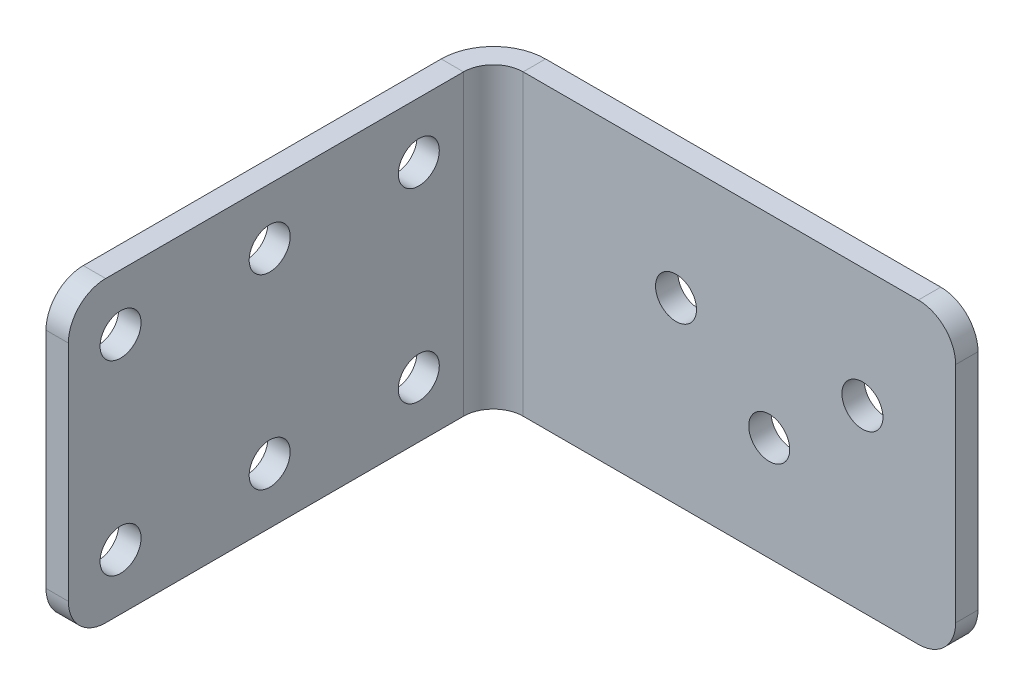
ISO-10303-21;
HEADER;
FILE_DESCRIPTION(('STEP AP214'),'2;1');
FILE_NAME('part.step','',(''),(''),'','','');
FILE_SCHEMA(('AUTOMOTIVE_DESIGN { 1 0 10303 214 1 1 1 1 }'));
ENDSEC;
DATA;
#1=APPLICATION_CONTEXT('core data for automotive mechanical design processes');
#2=APPLICATION_PROTOCOL_DEFINITION('international standard','automotive_design',2000,#1);
#3=PRODUCT_CONTEXT('',#1,'mechanical');
#4=PRODUCT('Part','Part','',(#3));
#5=PRODUCT_RELATED_PRODUCT_CATEGORY('part','',(#4));
#6=PRODUCT_DEFINITION_FORMATION('','',#4);
#7=PRODUCT_DEFINITION_CONTEXT('part definition',#1,'design');
#8=PRODUCT_DEFINITION('design','',#6,#7);
#9=PRODUCT_DEFINITION_SHAPE('','',#8);
#10=(LENGTH_UNIT() NAMED_UNIT(*) SI_UNIT(.MILLI.,.METRE.));
#11=(NAMED_UNIT(*) PLANE_ANGLE_UNIT() SI_UNIT($,.RADIAN.));
#12=(NAMED_UNIT(*) SI_UNIT($,.STERADIAN.) SOLID_ANGLE_UNIT());
#13=UNCERTAINTY_MEASURE_WITH_UNIT(LENGTH_MEASURE(1.E-05),#10,'distance_accuracy_value','');
#14=(GEOMETRIC_REPRESENTATION_CONTEXT(3) GLOBAL_UNCERTAINTY_ASSIGNED_CONTEXT((#13)) GLOBAL_UNIT_ASSIGNED_CONTEXT((#10,
#11,#12)) REPRESENTATION_CONTEXT('',''));
#15=CARTESIAN_POINT('',(0.,0.,0.));
#16=DIRECTION('',(0.,0.,1.));
#17=DIRECTION('',(1.,0.,0.));
#18=AXIS2_PLACEMENT_3D('',#15,#16,#17);
#19=CARTESIAN_POINT('',(7.,20.,0.));
#20=DIRECTION('',(0.,1.,0.));
#21=DIRECTION('',(0.,0.,1.));
#22=AXIS2_PLACEMENT_3D('',#19,#20,#21);
#23=PLANE('',#22);
#24=DIRECTION('',(0.,0.,1.));
#25=VECTOR('',#24,1.);
#26=CARTESIAN_POINT('',(7.,20.,0.));
#27=LINE('',#26,#25);
#28=CARTESIAN_POINT('',(7.,20.,0.));
#29=VERTEX_POINT('',#28);
#30=CARTESIAN_POINT('',(7.,20.,3.));
#31=VERTEX_POINT('',#30);
#32=EDGE_CURVE('E154',#29,#31,#27,.T.);
#33=ORIENTED_EDGE('',*,*,#32,.F.);
#34=CARTESIAN_POINT('',(7.,20.,7.));
#35=DIRECTION('',(0.,-1.,0.));
#36=DIRECTION('',(0.,0.,-1.));
#37=AXIS2_PLACEMENT_3D('',#34,#35,#36);
#38=CIRCLE('',#37,7.);
#39=CARTESIAN_POINT('',(0.,20.,7.));
#40=VERTEX_POINT('',#39);
#41=EDGE_CURVE('E150',#29,#40,#38,.F.);
#42=ORIENTED_EDGE('',*,*,#41,.T.);
#43=DIRECTION('',(-1.,0.,0.));
#44=VECTOR('',#43,1.);
#45=CARTESIAN_POINT('',(3.,20.,7.));
#46=LINE('',#45,#44);
#47=CARTESIAN_POINT('',(3.,20.,7.));
#48=VERTEX_POINT('',#47);
#49=EDGE_CURVE('E143',#48,#40,#46,.T.);
#50=ORIENTED_EDGE('',*,*,#49,.F.);
#51=CARTESIAN_POINT('',(7.,20.,7.));
#52=DIRECTION('',(0.,1.,0.));
#53=DIRECTION('',(1.,0.,0.));
#54=AXIS2_PLACEMENT_3D('',#51,#52,#53);
#55=CIRCLE('',#54,4.);
#56=EDGE_CURVE('E149',#31,#48,#55,.T.);
#57=ORIENTED_EDGE('',*,*,#56,.F.);
#58=EDGE_LOOP('',(#33,#42,#50,#57));
#59=FACE_BOUND('',#58,.T.);
#60=ADVANCED_FACE('F55',(#59),#23,.T.);
#61=CARTESIAN_POINT('',(3.,20.,7.));
#62=DIRECTION('',(0.,1.,0.));
#63=DIRECTION('',(0.,0.,1.));
#64=AXIS2_PLACEMENT_3D('',#61,#62,#63);
#65=PLANE('',#64);
#66=DIRECTION('',(1.,0.,0.));
#67=VECTOR('',#66,1.);
#68=CARTESIAN_POINT('',(0.,20.,3.));
#69=LINE('',#68,#67);
#70=CARTESIAN_POINT('',(60.,20.,3.));
#71=VERTEX_POINT('',#70);
#72=EDGE_CURVE('E174',#71,#31,#69,.F.);
#73=ORIENTED_EDGE('',*,*,#72,.F.);
#74=DIRECTION('',(0.,0.,1.));
#75=VECTOR('',#74,1.);
#76=CARTESIAN_POINT('',(60.,20.,7.));
#77=LINE('',#76,#75);
#78=CARTESIAN_POINT('',(60.,20.,0.));
#79=VERTEX_POINT('',#78);
#80=EDGE_CURVE('E233',#71,#79,#77,.F.);
#81=ORIENTED_EDGE('',*,*,#80,.T.);
#82=DIRECTION('',(-1.,0.,0.));
#83=VECTOR('',#82,1.);
#84=CARTESIAN_POINT('',(0.,20.,0.));
#85=LINE('',#84,#83);
#86=EDGE_CURVE('E180',#79,#29,#85,.T.);
#87=ORIENTED_EDGE('',*,*,#86,.T.);
#88=ORIENTED_EDGE('',*,*,#32,.T.);
#89=EDGE_LOOP('',(#73,#81,#87,#88));
#90=FACE_BOUND('',#89,.T.);
#91=ADVANCED_FACE('F351',(#90),#65,.T.);
#92=CARTESIAN_POINT('',(0.,-20.,7.));
#93=DIRECTION('',(0.,-1.,0.));
#94=DIRECTION('',(0.,0.,-1.));
#95=AXIS2_PLACEMENT_3D('',#92,#93,#94);
#96=PLANE('',#95);
#97=DIRECTION('',(1.,0.,0.));
#98=VECTOR('',#97,1.);
#99=CARTESIAN_POINT('',(0.,-20.,7.));
#100=LINE('',#99,#98);
#101=CARTESIAN_POINT('',(0.,-20.,7.));
#102=VERTEX_POINT('',#101);
#103=CARTESIAN_POINT('',(3.,-20.,7.));
#104=VERTEX_POINT('',#103);
#105=EDGE_CURVE('E151',#102,#104,#100,.T.);
#106=ORIENTED_EDGE('',*,*,#105,.F.);
#107=CARTESIAN_POINT('',(7.,-20.,7.));
#108=DIRECTION('',(0.,-1.,0.));
#109=DIRECTION('',(0.,0.,-1.));
#110=AXIS2_PLACEMENT_3D('',#107,#108,#109);
#111=CIRCLE('',#110,7.);
#112=CARTESIAN_POINT('',(7.,-20.,0.));
#113=VERTEX_POINT('',#112);
#114=EDGE_CURVE('E194',#113,#102,#111,.F.);
#115=ORIENTED_EDGE('',*,*,#114,.F.);
#116=DIRECTION('',(0.,0.,-1.));
#117=VECTOR('',#116,1.);
#118=CARTESIAN_POINT('',(7.,-20.,3.));
#119=LINE('',#118,#117);
#120=CARTESIAN_POINT('',(7.,-20.,3.));
#121=VERTEX_POINT('',#120);
#122=EDGE_CURVE('E214',#121,#113,#119,.T.);
#123=ORIENTED_EDGE('',*,*,#122,.F.);
#124=CARTESIAN_POINT('',(7.,-20.,7.));
#125=DIRECTION('',(0.,1.,0.));
#126=DIRECTION('',(1.,0.,0.));
#127=AXIS2_PLACEMENT_3D('',#124,#125,#126);
#128=CIRCLE('',#127,4.);
#129=EDGE_CURVE('E189',#121,#104,#128,.T.);
#130=ORIENTED_EDGE('',*,*,#129,.T.);
#131=EDGE_LOOP('',(#106,#115,#123,#130));
#132=FACE_BOUND('',#131,.T.);
#133=ADVANCED_FACE('F360',(#132),#96,.T.);
#134=CARTESIAN_POINT('',(7.,-20.,3.));
#135=DIRECTION('',(0.,-1.,0.));
#136=DIRECTION('',(0.,0.,-1.));
#137=AXIS2_PLACEMENT_3D('',#134,#135,#136);
#138=PLANE('',#137);
#139=DIRECTION('',(0.,0.,-1.));
#140=VECTOR('',#139,1.);
#141=CARTESIAN_POINT('',(3.,-20.,0.));
#142=LINE('',#141,#140);
#143=CARTESIAN_POINT('',(3.,-20.,55.));
#144=VERTEX_POINT('',#143);
#145=EDGE_CURVE('E162',#104,#144,#142,.F.);
#146=ORIENTED_EDGE('',*,*,#145,.T.);
#147=DIRECTION('',(-1.,0.,0.));
#148=VECTOR('',#147,1.);
#149=CARTESIAN_POINT('',(7.,-20.,55.));
#150=LINE('',#149,#148);
#151=CARTESIAN_POINT('',(0.,-20.,55.));
#152=VERTEX_POINT('',#151);
#153=EDGE_CURVE('E237',#144,#152,#150,.T.);
#154=ORIENTED_EDGE('',*,*,#153,.T.);
#155=DIRECTION('',(0.,0.,1.));
#156=VECTOR('',#155,1.);
#157=CARTESIAN_POINT('',(0.,-20.,0.));
#158=LINE('',#157,#156);
#159=EDGE_CURVE('E185',#102,#152,#158,.T.);
#160=ORIENTED_EDGE('',*,*,#159,.F.);
#161=ORIENTED_EDGE('',*,*,#105,.T.);
#162=EDGE_LOOP('',(#146,#154,#160,#161));
#163=FACE_BOUND('',#162,.T.);
#164=ADVANCED_FACE('F252',(#163),#138,.T.);
#165=CARTESIAN_POINT('',(0.,20.,0.));
#166=DIRECTION('',(1.,0.,0.));
#167=DIRECTION('',(0.,0.,-1.));
#168=AXIS2_PLACEMENT_3D('',#165,#166,#167);
#169=PLANE('',#168);
#170=CARTESIAN_POINT('',(0.,12.5,53.));
#171=DIRECTION('',(1.,0.,0.));
#172=DIRECTION('',(0.,0.,-1.));
#173=AXIS2_PLACEMENT_3D('',#170,#171,#172);
#174=CIRCLE('',#173,2.75);
#175=CARTESIAN_POINT('',(0.,12.5,50.25));
#176=VERTEX_POINT('',#175);
#177=EDGE_CURVE('E311',#176,#176,#174,.T.);
#178=ORIENTED_EDGE('',*,*,#177,.T.);
#179=EDGE_LOOP('',(#178));
#180=FACE_BOUND('',#179,.T.);
#181=CARTESIAN_POINT('',(0.,12.5,33.));
#182=DIRECTION('',(1.,0.,0.));
#183=DIRECTION('',(0.,0.,-1.));
#184=AXIS2_PLACEMENT_3D('',#181,#182,#183);
#185=CIRCLE('',#184,2.75);
#186=CARTESIAN_POINT('',(0.,12.5,30.25));
#187=VERTEX_POINT('',#186);
#188=EDGE_CURVE('E302',#187,#187,#185,.T.);
#189=ORIENTED_EDGE('',*,*,#188,.T.);
#190=EDGE_LOOP('',(#189));
#191=FACE_BOUND('',#190,.T.);
#192=CARTESIAN_POINT('',(0.,12.5,13.));
#193=DIRECTION('',(1.,0.,0.));
#194=DIRECTION('',(0.,0.,-1.));
#195=AXIS2_PLACEMENT_3D('',#192,#193,#194);
#196=CIRCLE('',#195,2.75);
#197=CARTESIAN_POINT('',(0.,12.5,10.25));
#198=VERTEX_POINT('',#197);
#199=EDGE_CURVE('E300',#198,#198,#196,.T.);
#200=ORIENTED_EDGE('',*,*,#199,.T.);
#201=EDGE_LOOP('',(#200));
#202=FACE_BOUND('',#201,.T.);
#203=CARTESIAN_POINT('',(0.,-12.5,13.));
#204=DIRECTION('',(1.,0.,0.));
#205=DIRECTION('',(0.,0.,-1.));
#206=AXIS2_PLACEMENT_3D('',#203,#204,#205);
#207=CIRCLE('',#206,2.75);
#208=CARTESIAN_POINT('',(0.,-12.5,10.25));
#209=VERTEX_POINT('',#208);
#210=EDGE_CURVE('E293',#209,#209,#207,.T.);
#211=ORIENTED_EDGE('',*,*,#210,.T.);
#212=EDGE_LOOP('',(#211));
#213=FACE_BOUND('',#212,.T.);
#214=CARTESIAN_POINT('',(0.,-12.5,33.));
#215=DIRECTION('',(1.,0.,0.));
#216=DIRECTION('',(0.,0.,-1.));
#217=AXIS2_PLACEMENT_3D('',#214,#215,#216);
#218=CIRCLE('',#217,2.75);
#219=CARTESIAN_POINT('',(0.,-12.5,30.25));
#220=VERTEX_POINT('',#219);
#221=EDGE_CURVE('E287',#220,#220,#218,.T.);
#222=ORIENTED_EDGE('',*,*,#221,.T.);
#223=EDGE_LOOP('',(#222));
#224=FACE_BOUND('',#223,.T.);
#225=CARTESIAN_POINT('',(0.,-12.5,53.));
#226=DIRECTION('',(1.,0.,0.));
#227=DIRECTION('',(0.,0.,-1.));
#228=AXIS2_PLACEMENT_3D('',#225,#226,#227);
#229=CIRCLE('',#228,2.75);
#230=CARTESIAN_POINT('',(0.,-12.5,50.25));
#231=VERTEX_POINT('',#230);
#232=EDGE_CURVE('E282',#231,#231,#229,.T.);
#233=ORIENTED_EDGE('',*,*,#232,.T.);
#234=EDGE_LOOP('',(#233));
#235=FACE_BOUND('',#234,.T.);
#236=ORIENTED_EDGE('',*,*,#159,.T.);
#237=CARTESIAN_POINT('',(0.,-15.,55.));
#238=DIRECTION('',(1.,0.,0.));
#239=DIRECTION('',(0.,0.,-1.));
#240=AXIS2_PLACEMENT_3D('',#237,#238,#239);
#241=CIRCLE('',#240,5.);
#242=CARTESIAN_POINT('',(0.,-15.,60.));
#243=VERTEX_POINT('',#242);
#244=EDGE_CURVE('E245',#152,#243,#241,.F.);
#245=ORIENTED_EDGE('',*,*,#244,.T.);
#246=DIRECTION('',(0.,-1.,0.));
#247=VECTOR('',#246,1.);
#248=CARTESIAN_POINT('',(0.,20.,60.));
#249=LINE('',#248,#247);
#250=CARTESIAN_POINT('',(0.,15.,60.));
#251=VERTEX_POINT('',#250);
#252=EDGE_CURVE('E211',#251,#243,#249,.T.);
#253=ORIENTED_EDGE('',*,*,#252,.F.);
#254=CARTESIAN_POINT('',(0.,15.,55.));
#255=DIRECTION('',(1.,0.,0.));
#256=DIRECTION('',(0.,0.,-1.));
#257=AXIS2_PLACEMENT_3D('',#254,#255,#256);
#258=CIRCLE('',#257,5.);
#259=CARTESIAN_POINT('',(0.,20.,55.));
#260=VERTEX_POINT('',#259);
#261=EDGE_CURVE('E240',#251,#260,#258,.F.);
#262=ORIENTED_EDGE('',*,*,#261,.T.);
#263=DIRECTION('',(0.,0.,1.));
#264=VECTOR('',#263,1.);
#265=CARTESIAN_POINT('',(0.,20.,0.));
#266=LINE('',#265,#264);
#267=EDGE_CURVE('E169',#40,#260,#266,.T.);
#268=ORIENTED_EDGE('',*,*,#267,.F.);
#269=DIRECTION('',(0.,-1.,0.));
#270=VECTOR('',#269,1.);
#271=CARTESIAN_POINT('',(0.,20.,7.));
#272=LINE('',#271,#270);
#273=EDGE_CURVE('E181',#40,#102,#272,.T.);
#274=ORIENTED_EDGE('',*,*,#273,.T.);
#275=EDGE_LOOP('',(#236,#245,#253,#262,#268,#274));
#276=FACE_BOUND('',#275,.T.);
#277=ADVANCED_FACE('F256',(#180,#191,#202,#213,#224,#235,#276),#169,.F.);
#278=CARTESIAN_POINT('',(3.,20.,60.));
#279=DIRECTION('',(0.,0.,1.));
#280=DIRECTION('',(1.,0.,0.));
#281=AXIS2_PLACEMENT_3D('',#278,#279,#280);
#282=PLANE('',#281);
#283=ORIENTED_EDGE('',*,*,#252,.T.);
#284=DIRECTION('',(-1.,0.,0.));
#285=VECTOR('',#284,1.);
#286=CARTESIAN_POINT('',(3.,-15.,60.));
#287=LINE('',#286,#285);
#288=CARTESIAN_POINT('',(3.,-15.,60.));
#289=VERTEX_POINT('',#288);
#290=EDGE_CURVE('E72',#243,#289,#287,.F.);
#291=ORIENTED_EDGE('',*,*,#290,.T.);
#292=DIRECTION('',(0.,-1.,0.));
#293=VECTOR('',#292,1.);
#294=CARTESIAN_POINT('',(3.,20.,60.));
#295=LINE('',#294,#293);
#296=CARTESIAN_POINT('',(3.,15.,60.));
#297=VERTEX_POINT('',#296);
#298=EDGE_CURVE('E166',#297,#289,#295,.T.);
#299=ORIENTED_EDGE('',*,*,#298,.F.);
#300=DIRECTION('',(-1.,0.,0.));
#301=VECTOR('',#300,1.);
#302=CARTESIAN_POINT('',(3.,15.,60.));
#303=LINE('',#302,#301);
#304=EDGE_CURVE('E242',#297,#251,#303,.T.);
#305=ORIENTED_EDGE('',*,*,#304,.T.);
#306=EDGE_LOOP('',(#283,#291,#299,#305));
#307=FACE_BOUND('',#306,.T.);
#308=ADVANCED_FACE('F260',(#307),#282,.T.);
#309=CARTESIAN_POINT('',(3.,20.,0.));
#310=DIRECTION('',(1.,0.,0.));
#311=DIRECTION('',(0.,0.,-1.));
#312=AXIS2_PLACEMENT_3D('',#309,#310,#311);
#313=PLANE('',#312);
#314=CARTESIAN_POINT('',(3.,12.5,53.));
#315=DIRECTION('',(1.,0.,0.));
#316=DIRECTION('',(0.,0.,-1.));
#317=AXIS2_PLACEMENT_3D('',#314,#315,#316);
#318=CIRCLE('',#317,2.75);
#319=CARTESIAN_POINT('',(3.,12.5,50.25));
#320=VERTEX_POINT('',#319);
#321=EDGE_CURVE('E313',#320,#320,#318,.T.);
#322=ORIENTED_EDGE('',*,*,#321,.F.);
#323=EDGE_LOOP('',(#322));
#324=FACE_BOUND('',#323,.T.);
#325=CARTESIAN_POINT('',(3.,12.5,33.));
#326=DIRECTION('',(1.,0.,0.));
#327=DIRECTION('',(0.,0.,-1.));
#328=AXIS2_PLACEMENT_3D('',#325,#326,#327);
#329=CIRCLE('',#328,2.75);
#330=CARTESIAN_POINT('',(3.,12.5,30.25));
#331=VERTEX_POINT('',#330);
#332=EDGE_CURVE('E306',#331,#331,#329,.T.);
#333=ORIENTED_EDGE('',*,*,#332,.F.);
#334=EDGE_LOOP('',(#333));
#335=FACE_BOUND('',#334,.T.);
#336=CARTESIAN_POINT('',(3.,12.5,13.));
#337=DIRECTION('',(1.,0.,0.));
#338=DIRECTION('',(0.,0.,-1.));
#339=AXIS2_PLACEMENT_3D('',#336,#337,#338);
#340=CIRCLE('',#339,2.75);
#341=CARTESIAN_POINT('',(3.,12.5,10.25));
#342=VERTEX_POINT('',#341);
#343=EDGE_CURVE('E301',#342,#342,#340,.T.);
#344=ORIENTED_EDGE('',*,*,#343,.F.);
#345=EDGE_LOOP('',(#344));
#346=FACE_BOUND('',#345,.T.);
#347=CARTESIAN_POINT('',(3.,-12.5,13.));
#348=DIRECTION('',(1.,0.,0.));
#349=DIRECTION('',(0.,0.,-1.));
#350=AXIS2_PLACEMENT_3D('',#347,#348,#349);
#351=CIRCLE('',#350,2.75);
#352=CARTESIAN_POINT('',(3.,-12.5,10.25));
#353=VERTEX_POINT('',#352);
#354=EDGE_CURVE('E298',#353,#353,#351,.T.);
#355=ORIENTED_EDGE('',*,*,#354,.F.);
#356=EDGE_LOOP('',(#355));
#357=FACE_BOUND('',#356,.T.);
#358=CARTESIAN_POINT('',(3.,-12.5,33.));
#359=DIRECTION('',(1.,0.,0.));
#360=DIRECTION('',(0.,0.,-1.));
#361=AXIS2_PLACEMENT_3D('',#358,#359,#360);
#362=CIRCLE('',#361,2.75);
#363=CARTESIAN_POINT('',(3.,-12.5,30.25));
#364=VERTEX_POINT('',#363);
#365=EDGE_CURVE('E290',#364,#364,#362,.T.);
#366=ORIENTED_EDGE('',*,*,#365,.F.);
#367=EDGE_LOOP('',(#366));
#368=FACE_BOUND('',#367,.T.);
#369=CARTESIAN_POINT('',(3.,-12.5,53.));
#370=DIRECTION('',(1.,0.,0.));
#371=DIRECTION('',(0.,0.,-1.));
#372=AXIS2_PLACEMENT_3D('',#369,#370,#371);
#373=CIRCLE('',#372,2.75);
#374=CARTESIAN_POINT('',(3.,-12.5,50.25));
#375=VERTEX_POINT('',#374);
#376=EDGE_CURVE('E281',#375,#375,#373,.T.);
#377=ORIENTED_EDGE('',*,*,#376,.F.);
#378=EDGE_LOOP('',(#377));
#379=FACE_BOUND('',#378,.T.);
#380=ORIENTED_EDGE('',*,*,#298,.T.);
#381=CARTESIAN_POINT('',(3.,-15.,55.));
#382=DIRECTION('',(1.,0.,0.));
#383=DIRECTION('',(0.,0.,-1.));
#384=AXIS2_PLACEMENT_3D('',#381,#382,#383);
#385=CIRCLE('',#384,5.);
#386=EDGE_CURVE('E58',#289,#144,#385,.T.);
#387=ORIENTED_EDGE('',*,*,#386,.T.);
#388=ORIENTED_EDGE('',*,*,#145,.F.);
#389=DIRECTION('',(0.,-1.,0.));
#390=VECTOR('',#389,1.);
#391=CARTESIAN_POINT('',(3.,20.,7.));
#392=LINE('',#391,#390);
#393=EDGE_CURVE('E160',#48,#104,#392,.T.);
#394=ORIENTED_EDGE('',*,*,#393,.F.);
#395=DIRECTION('',(0.,0.,-1.));
#396=VECTOR('',#395,1.);
#397=CARTESIAN_POINT('',(3.,20.,0.));
#398=LINE('',#397,#396);
#399=CARTESIAN_POINT('',(3.,20.,55.));
#400=VERTEX_POINT('',#399);
#401=EDGE_CURVE('E159',#48,#400,#398,.F.);
#402=ORIENTED_EDGE('',*,*,#401,.T.);
#403=CARTESIAN_POINT('',(3.,15.,55.));
#404=DIRECTION('',(1.,0.,0.));
#405=DIRECTION('',(0.,0.,-1.));
#406=AXIS2_PLACEMENT_3D('',#403,#404,#405);
#407=CIRCLE('',#406,5.);
#408=EDGE_CURVE('E247',#400,#297,#407,.T.);
#409=ORIENTED_EDGE('',*,*,#408,.T.);
#410=EDGE_LOOP('',(#380,#387,#388,#394,#402,#409));
#411=FACE_BOUND('',#410,.T.);
#412=ADVANCED_FACE('F156',(#324,#335,#346,#357,#368,#379,#411),#313,.T.);
#413=CARTESIAN_POINT('',(7.,20.,7.));
#414=DIRECTION('',(0.,-1.,0.));
#415=DIRECTION('',(0.,0.,-1.));
#416=AXIS2_PLACEMENT_3D('',#413,#414,#415);
#417=CYLINDRICAL_SURFACE('',#416,4.);
#418=ORIENTED_EDGE('',*,*,#129,.F.);
#419=DIRECTION('',(0.,-1.,0.));
#420=VECTOR('',#419,1.);
#421=CARTESIAN_POINT('',(7.,20.,3.));
#422=LINE('',#421,#420);
#423=EDGE_CURVE('E170',#31,#121,#422,.T.);
#424=ORIENTED_EDGE('',*,*,#423,.F.);
#425=ORIENTED_EDGE('',*,*,#56,.T.);
#426=ORIENTED_EDGE('',*,*,#393,.T.);
#427=EDGE_LOOP('',(#418,#424,#425,#426));
#428=FACE_BOUND('',#427,.T.);
#429=ADVANCED_FACE('F172',(#428),#417,.F.);
#430=CARTESIAN_POINT('',(0.,20.,3.));
#431=DIRECTION('',(0.,0.,1.));
#432=DIRECTION('',(1.,0.,0.));
#433=AXIS2_PLACEMENT_3D('',#430,#431,#432);
#434=PLANE('',#433);
#435=CARTESIAN_POINT('',(27.5,4.,3.));
#436=DIRECTION('',(0.,0.,1.));
#437=DIRECTION('',(1.,0.,0.));
#438=AXIS2_PLACEMENT_3D('',#435,#436,#437);
#439=CIRCLE('',#438,2.74999999999999);
#440=CARTESIAN_POINT('',(30.25,4.,3.));
#441=VERTEX_POINT('',#440);
#442=EDGE_CURVE('E277',#441,#441,#439,.T.);
#443=ORIENTED_EDGE('',*,*,#442,.F.);
#444=EDGE_LOOP('',(#443));
#445=FACE_BOUND('',#444,.T.);
#446=CARTESIAN_POINT('',(40.,-6.,3.));
#447=DIRECTION('',(0.,0.,1.));
#448=DIRECTION('',(1.,0.,0.));
#449=AXIS2_PLACEMENT_3D('',#446,#447,#448);
#450=CIRCLE('',#449,2.75);
#451=CARTESIAN_POINT('',(42.75,-6.,3.));
#452=VERTEX_POINT('',#451);
#453=EDGE_CURVE('E275',#452,#452,#450,.T.);
#454=ORIENTED_EDGE('',*,*,#453,.F.);
#455=EDGE_LOOP('',(#454));
#456=FACE_BOUND('',#455,.T.);
#457=CARTESIAN_POINT('',(52.5,4.,3.));
#458=DIRECTION('',(0.,0.,1.));
#459=DIRECTION('',(1.,0.,0.));
#460=AXIS2_PLACEMENT_3D('',#457,#458,#459);
#461=CIRCLE('',#460,2.74999999999999);
#462=CARTESIAN_POINT('',(55.25,4.,3.));
#463=VERTEX_POINT('',#462);
#464=EDGE_CURVE('E266',#463,#463,#461,.T.);
#465=ORIENTED_EDGE('',*,*,#464,.F.);
#466=EDGE_LOOP('',(#465));
#467=FACE_BOUND('',#466,.T.);
#468=DIRECTION('',(1.,0.,0.));
#469=VECTOR('',#468,1.);
#470=CARTESIAN_POINT('',(0.,-20.,3.));
#471=LINE('',#470,#469);
#472=CARTESIAN_POINT('',(60.,-20.,3.));
#473=VERTEX_POINT('',#472);
#474=EDGE_CURVE('E191',#473,#121,#471,.F.);
#475=ORIENTED_EDGE('',*,*,#474,.F.);
#476=CARTESIAN_POINT('',(60.,-15.,3.));
#477=DIRECTION('',(0.,0.,1.));
#478=DIRECTION('',(1.,0.,0.));
#479=AXIS2_PLACEMENT_3D('',#476,#477,#478);
#480=CIRCLE('',#479,5.);
#481=CARTESIAN_POINT('',(65.,-15.,3.));
#482=VERTEX_POINT('',#481);
#483=EDGE_CURVE('E225',#473,#482,#480,.T.);
#484=ORIENTED_EDGE('',*,*,#483,.T.);
#485=DIRECTION('',(0.,-1.,0.));
#486=VECTOR('',#485,1.);
#487=CARTESIAN_POINT('',(65.,20.,3.));
#488=LINE('',#487,#486);
#489=CARTESIAN_POINT('',(65.,15.,3.));
#490=VERTEX_POINT('',#489);
#491=EDGE_CURVE('E207',#490,#482,#488,.T.);
#492=ORIENTED_EDGE('',*,*,#491,.F.);
#493=CARTESIAN_POINT('',(60.,15.,3.));
#494=DIRECTION('',(0.,0.,1.));
#495=DIRECTION('',(1.,0.,0.));
#496=AXIS2_PLACEMENT_3D('',#493,#494,#495);
#497=CIRCLE('',#496,5.);
#498=EDGE_CURVE('E224',#490,#71,#497,.T.);
#499=ORIENTED_EDGE('',*,*,#498,.T.);
#500=ORIENTED_EDGE('',*,*,#72,.T.);
#501=ORIENTED_EDGE('',*,*,#423,.T.);
#502=EDGE_LOOP('',(#475,#484,#492,#499,#500,#501));
#503=FACE_BOUND('',#502,.T.);
#504=ADVANCED_FACE('F518',(#445,#456,#467,#503),#434,.T.);
#505=CARTESIAN_POINT('',(65.,20.,0.));
#506=DIRECTION('',(1.,0.,0.));
#507=DIRECTION('',(0.,0.,-1.));
#508=AXIS2_PLACEMENT_3D('',#505,#506,#507);
#509=PLANE('',#508);
#510=ORIENTED_EDGE('',*,*,#491,.T.);
#511=DIRECTION('',(0.,0.,1.));
#512=VECTOR('',#511,1.);
#513=CARTESIAN_POINT('',(65.,-15.,0.));
#514=LINE('',#513,#512);
#515=CARTESIAN_POINT('',(65.,-15.,0.));
#516=VERTEX_POINT('',#515);
#517=EDGE_CURVE('E228',#482,#516,#514,.F.);
#518=ORIENTED_EDGE('',*,*,#517,.T.);
#519=DIRECTION('',(0.,-1.,0.));
#520=VECTOR('',#519,1.);
#521=CARTESIAN_POINT('',(65.,20.,0.));
#522=LINE('',#521,#520);
#523=CARTESIAN_POINT('',(65.,15.,0.));
#524=VERTEX_POINT('',#523);
#525=EDGE_CURVE('E202',#524,#516,#522,.T.);
#526=ORIENTED_EDGE('',*,*,#525,.F.);
#527=DIRECTION('',(0.,0.,1.));
#528=VECTOR('',#527,1.);
#529=CARTESIAN_POINT('',(65.,15.,0.));
#530=LINE('',#529,#528);
#531=EDGE_CURVE('E229',#524,#490,#530,.T.);
#532=ORIENTED_EDGE('',*,*,#531,.T.);
#533=EDGE_LOOP('',(#510,#518,#526,#532));
#534=FACE_BOUND('',#533,.T.);
#535=ADVANCED_FACE('F510',(#534),#509,.T.);
#536=CARTESIAN_POINT('',(0.,20.,0.));
#537=DIRECTION('',(0.,0.,1.));
#538=DIRECTION('',(1.,0.,0.));
#539=AXIS2_PLACEMENT_3D('',#536,#537,#538);
#540=PLANE('',#539);
#541=CARTESIAN_POINT('',(27.5,4.,0.));
#542=DIRECTION('',(0.,0.,1.));
#543=DIRECTION('',(1.,0.,0.));
#544=AXIS2_PLACEMENT_3D('',#541,#542,#543);
#545=CIRCLE('',#544,2.74999999999999);
#546=CARTESIAN_POINT('',(30.25,4.,0.));
#547=VERTEX_POINT('',#546);
#548=EDGE_CURVE('E274',#547,#547,#545,.T.);
#549=ORIENTED_EDGE('',*,*,#548,.T.);
#550=EDGE_LOOP('',(#549));
#551=FACE_BOUND('',#550,.T.);
#552=CARTESIAN_POINT('',(40.,-6.,0.));
#553=DIRECTION('',(0.,0.,1.));
#554=DIRECTION('',(1.,0.,0.));
#555=AXIS2_PLACEMENT_3D('',#552,#553,#554);
#556=CIRCLE('',#555,2.75);
#557=CARTESIAN_POINT('',(42.75,-6.,0.));
#558=VERTEX_POINT('',#557);
#559=EDGE_CURVE('E267',#558,#558,#556,.T.);
#560=ORIENTED_EDGE('',*,*,#559,.T.);
#561=EDGE_LOOP('',(#560));
#562=FACE_BOUND('',#561,.T.);
#563=CARTESIAN_POINT('',(52.5,4.,0.));
#564=DIRECTION('',(0.,0.,1.));
#565=DIRECTION('',(1.,0.,0.));
#566=AXIS2_PLACEMENT_3D('',#563,#564,#565);
#567=CIRCLE('',#566,2.74999999999999);
#568=CARTESIAN_POINT('',(55.25,4.,0.));
#569=VERTEX_POINT('',#568);
#570=EDGE_CURVE('E190',#569,#569,#567,.T.);
#571=ORIENTED_EDGE('',*,*,#570,.T.);
#572=EDGE_LOOP('',(#571));
#573=FACE_BOUND('',#572,.T.);
#574=ORIENTED_EDGE('',*,*,#525,.T.);
#575=CARTESIAN_POINT('',(60.,-15.,0.));
#576=DIRECTION('',(0.,0.,1.));
#577=DIRECTION('',(1.,0.,0.));
#578=AXIS2_PLACEMENT_3D('',#575,#576,#577);
#579=CIRCLE('',#578,5.);
#580=CARTESIAN_POINT('',(60.,-20.,0.));
#581=VERTEX_POINT('',#580);
#582=EDGE_CURVE('E231',#516,#581,#579,.F.);
#583=ORIENTED_EDGE('',*,*,#582,.T.);
#584=DIRECTION('',(-1.,0.,0.));
#585=VECTOR('',#584,1.);
#586=CARTESIAN_POINT('',(0.,-20.,0.));
#587=LINE('',#586,#585);
#588=EDGE_CURVE('E193',#581,#113,#587,.T.);
#589=ORIENTED_EDGE('',*,*,#588,.T.);
#590=DIRECTION('',(0.,-1.,0.));
#591=VECTOR('',#590,1.);
#592=CARTESIAN_POINT('',(7.,20.,0.));
#593=LINE('',#592,#591);
#594=EDGE_CURVE('E199',#29,#113,#593,.T.);
#595=ORIENTED_EDGE('',*,*,#594,.F.);
#596=ORIENTED_EDGE('',*,*,#86,.F.);
#597=CARTESIAN_POINT('',(60.,15.,0.));
#598=DIRECTION('',(0.,0.,1.));
#599=DIRECTION('',(1.,0.,0.));
#600=AXIS2_PLACEMENT_3D('',#597,#598,#599);
#601=CIRCLE('',#600,5.);
#602=EDGE_CURVE('E232',#79,#524,#601,.F.);
#603=ORIENTED_EDGE('',*,*,#602,.T.);
#604=EDGE_LOOP('',(#574,#583,#589,#595,#596,#603));
#605=FACE_BOUND('',#604,.T.);
#606=ADVANCED_FACE('F496',(#551,#562,#573,#605),#540,.F.);
#607=CARTESIAN_POINT('',(7.,20.,7.));
#608=DIRECTION('',(0.,-1.,0.));
#609=DIRECTION('',(0.,0.,-1.));
#610=AXIS2_PLACEMENT_3D('',#607,#608,#609);
#611=CYLINDRICAL_SURFACE('',#610,7.);
#612=ORIENTED_EDGE('',*,*,#114,.T.);
#613=ORIENTED_EDGE('',*,*,#273,.F.);
#614=ORIENTED_EDGE('',*,*,#41,.F.);
#615=ORIENTED_EDGE('',*,*,#594,.T.);
#616=EDGE_LOOP('',(#612,#613,#614,#615));
#617=FACE_BOUND('',#616,.T.);
#618=ADVANCED_FACE('F488',(#617),#611,.T.);
#619=CARTESIAN_POINT('',(7.,20.,7.));
#620=DIRECTION('',(0.,1.,0.));
#621=DIRECTION('',(1.,0.,0.));
#622=AXIS2_PLACEMENT_3D('',#619,#620,#621);
#623=PLANE('',#622);
#624=ORIENTED_EDGE('',*,*,#267,.T.);
#625=DIRECTION('',(-1.,0.,0.));
#626=VECTOR('',#625,1.);
#627=CARTESIAN_POINT('',(7.,20.,55.));
#628=LINE('',#627,#626);
#629=EDGE_CURVE('E13',#260,#400,#628,.F.);
#630=ORIENTED_EDGE('',*,*,#629,.T.);
#631=ORIENTED_EDGE('',*,*,#401,.F.);
#632=ORIENTED_EDGE('',*,*,#49,.T.);
#633=EDGE_LOOP('',(#624,#630,#631,#632));
#634=FACE_BOUND('',#633,.T.);
#635=ADVANCED_FACE('F167',(#634),#623,.T.);
#636=CARTESIAN_POINT('',(7.,-20.,7.));
#637=DIRECTION('',(0.,1.,0.));
#638=DIRECTION('',(1.,0.,0.));
#639=AXIS2_PLACEMENT_3D('',#636,#637,#638);
#640=PLANE('',#639);
#641=ORIENTED_EDGE('',*,*,#588,.F.);
#642=DIRECTION('',(0.,0.,1.));
#643=VECTOR('',#642,1.);
#644=CARTESIAN_POINT('',(60.,-20.,3.));
#645=LINE('',#644,#643);
#646=EDGE_CURVE('E217',#581,#473,#645,.T.);
#647=ORIENTED_EDGE('',*,*,#646,.T.);
#648=ORIENTED_EDGE('',*,*,#474,.T.);
#649=ORIENTED_EDGE('',*,*,#122,.T.);
#650=EDGE_LOOP('',(#641,#647,#648,#649));
#651=FACE_BOUND('',#650,.T.);
#652=ADVANCED_FACE('F466',(#651),#640,.F.);
#653=CARTESIAN_POINT('',(52.5,4.,3.));
#654=DIRECTION('',(0.,0.,1.));
#655=DIRECTION('',(1.,0.,0.));
#656=AXIS2_PLACEMENT_3D('',#653,#654,#655);
#657=CYLINDRICAL_SURFACE('',#656,2.74999999999999);
#658=ORIENTED_EDGE('',*,*,#570,.F.);
#659=EDGE_LOOP('',(#658));
#660=FACE_BOUND('',#659,.T.);
#661=ORIENTED_EDGE('',*,*,#464,.T.);
#662=EDGE_LOOP('',(#661));
#663=FACE_BOUND('',#662,.T.);
#664=ADVANCED_FACE('F457',(#660,#663),#657,.F.);
#665=CARTESIAN_POINT('',(40.,-6.,3.));
#666=DIRECTION('',(0.,0.,1.));
#667=DIRECTION('',(1.,0.,0.));
#668=AXIS2_PLACEMENT_3D('',#665,#666,#667);
#669=CYLINDRICAL_SURFACE('',#668,2.75);
#670=ORIENTED_EDGE('',*,*,#559,.F.);
#671=EDGE_LOOP('',(#670));
#672=FACE_BOUND('',#671,.T.);
#673=ORIENTED_EDGE('',*,*,#453,.T.);
#674=EDGE_LOOP('',(#673));
#675=FACE_BOUND('',#674,.T.);
#676=ADVANCED_FACE('F346',(#672,#675),#669,.F.);
#677=CARTESIAN_POINT('',(27.5,4.,3.));
#678=DIRECTION('',(0.,0.,1.));
#679=DIRECTION('',(1.,0.,0.));
#680=AXIS2_PLACEMENT_3D('',#677,#678,#679);
#681=CYLINDRICAL_SURFACE('',#680,2.74999999999999);
#682=ORIENTED_EDGE('',*,*,#548,.F.);
#683=EDGE_LOOP('',(#682));
#684=FACE_BOUND('',#683,.T.);
#685=ORIENTED_EDGE('',*,*,#442,.T.);
#686=EDGE_LOOP('',(#685));
#687=FACE_BOUND('',#686,.T.);
#688=ADVANCED_FACE('F338',(#684,#687),#681,.F.);
#689=CARTESIAN_POINT('',(3.,-12.5,53.));
#690=DIRECTION('',(1.,0.,0.));
#691=DIRECTION('',(0.,0.,-1.));
#692=AXIS2_PLACEMENT_3D('',#689,#690,#691);
#693=CYLINDRICAL_SURFACE('',#692,2.75);
#694=ORIENTED_EDGE('',*,*,#232,.F.);
#695=EDGE_LOOP('',(#694));
#696=FACE_BOUND('',#695,.T.);
#697=ORIENTED_EDGE('',*,*,#376,.T.);
#698=EDGE_LOOP('',(#697));
#699=FACE_BOUND('',#698,.T.);
#700=ADVANCED_FACE('F331',(#696,#699),#693,.F.);
#701=CARTESIAN_POINT('',(3.,-12.5,33.));
#702=DIRECTION('',(1.,0.,0.));
#703=DIRECTION('',(0.,0.,-1.));
#704=AXIS2_PLACEMENT_3D('',#701,#702,#703);
#705=CYLINDRICAL_SURFACE('',#704,2.75);
#706=ORIENTED_EDGE('',*,*,#221,.F.);
#707=EDGE_LOOP('',(#706));
#708=FACE_BOUND('',#707,.T.);
#709=ORIENTED_EDGE('',*,*,#365,.T.);
#710=EDGE_LOOP('',(#709));
#711=FACE_BOUND('',#710,.T.);
#712=ADVANCED_FACE('F334',(#708,#711),#705,.F.);
#713=CARTESIAN_POINT('',(3.,-12.5,13.));
#714=DIRECTION('',(1.,0.,0.));
#715=DIRECTION('',(0.,0.,-1.));
#716=AXIS2_PLACEMENT_3D('',#713,#714,#715);
#717=CYLINDRICAL_SURFACE('',#716,2.75);
#718=ORIENTED_EDGE('',*,*,#210,.F.);
#719=EDGE_LOOP('',(#718));
#720=FACE_BOUND('',#719,.T.);
#721=ORIENTED_EDGE('',*,*,#354,.T.);
#722=EDGE_LOOP('',(#721));
#723=FACE_BOUND('',#722,.T.);
#724=ADVANCED_FACE('F343',(#720,#723),#717,.F.);
#725=CARTESIAN_POINT('',(3.,12.5,13.));
#726=DIRECTION('',(1.,0.,0.));
#727=DIRECTION('',(0.,0.,-1.));
#728=AXIS2_PLACEMENT_3D('',#725,#726,#727);
#729=CYLINDRICAL_SURFACE('',#728,2.75);
#730=ORIENTED_EDGE('',*,*,#199,.F.);
#731=EDGE_LOOP('',(#730));
#732=FACE_BOUND('',#731,.T.);
#733=ORIENTED_EDGE('',*,*,#343,.T.);
#734=EDGE_LOOP('',(#733));
#735=FACE_BOUND('',#734,.T.);
#736=ADVANCED_FACE('F415',(#732,#735),#729,.F.);
#737=CARTESIAN_POINT('',(3.,12.5,33.));
#738=DIRECTION('',(1.,0.,0.));
#739=DIRECTION('',(0.,0.,-1.));
#740=AXIS2_PLACEMENT_3D('',#737,#738,#739);
#741=CYLINDRICAL_SURFACE('',#740,2.75);
#742=ORIENTED_EDGE('',*,*,#188,.F.);
#743=EDGE_LOOP('',(#742));
#744=FACE_BOUND('',#743,.T.);
#745=ORIENTED_EDGE('',*,*,#332,.T.);
#746=EDGE_LOOP('',(#745));
#747=FACE_BOUND('',#746,.T.);
#748=ADVANCED_FACE('F405',(#744,#747),#741,.F.);
#749=CARTESIAN_POINT('',(3.,12.5,53.));
#750=DIRECTION('',(1.,0.,0.));
#751=DIRECTION('',(0.,0.,-1.));
#752=AXIS2_PLACEMENT_3D('',#749,#750,#751);
#753=CYLINDRICAL_SURFACE('',#752,2.75);
#754=ORIENTED_EDGE('',*,*,#177,.F.);
#755=EDGE_LOOP('',(#754));
#756=FACE_BOUND('',#755,.T.);
#757=ORIENTED_EDGE('',*,*,#321,.T.);
#758=EDGE_LOOP('',(#757));
#759=FACE_BOUND('',#758,.T.);
#760=ADVANCED_FACE('F318',(#756,#759),#753,.F.);
#761=CARTESIAN_POINT('',(60.,-15.,7.));
#762=DIRECTION('',(0.,0.,-1.));
#763=DIRECTION('',(-1.,0.,0.));
#764=AXIS2_PLACEMENT_3D('',#761,#762,#763);
#765=CYLINDRICAL_SURFACE('',#764,5.);
#766=ORIENTED_EDGE('',*,*,#582,.F.);
#767=ORIENTED_EDGE('',*,*,#517,.F.);
#768=ORIENTED_EDGE('',*,*,#483,.F.);
#769=ORIENTED_EDGE('',*,*,#646,.F.);
#770=EDGE_LOOP('',(#766,#767,#768,#769));
#771=FACE_BOUND('',#770,.T.);
#772=ADVANCED_FACE('F362',(#771),#765,.T.);
#773=CARTESIAN_POINT('',(60.,15.,0.));
#774=DIRECTION('',(0.,0.,1.));
#775=DIRECTION('',(1.,0.,0.));
#776=AXIS2_PLACEMENT_3D('',#773,#774,#775);
#777=CYLINDRICAL_SURFACE('',#776,5.);
#778=ORIENTED_EDGE('',*,*,#602,.F.);
#779=ORIENTED_EDGE('',*,*,#80,.F.);
#780=ORIENTED_EDGE('',*,*,#498,.F.);
#781=ORIENTED_EDGE('',*,*,#531,.F.);
#782=EDGE_LOOP('',(#778,#779,#780,#781));
#783=FACE_BOUND('',#782,.T.);
#784=ADVANCED_FACE('F365',(#783),#777,.T.);
#785=CARTESIAN_POINT('',(7.,-15.,55.));
#786=DIRECTION('',(-1.,0.,0.));
#787=DIRECTION('',(0.,0.,1.));
#788=AXIS2_PLACEMENT_3D('',#785,#786,#787);
#789=CYLINDRICAL_SURFACE('',#788,5.);
#790=ORIENTED_EDGE('',*,*,#386,.F.);
#791=ORIENTED_EDGE('',*,*,#290,.F.);
#792=ORIENTED_EDGE('',*,*,#244,.F.);
#793=ORIENTED_EDGE('',*,*,#153,.F.);
#794=EDGE_LOOP('',(#790,#791,#792,#793));
#795=FACE_BOUND('',#794,.T.);
#796=ADVANCED_FACE('F254',(#795),#789,.T.);
#797=CARTESIAN_POINT('',(3.,15.,55.));
#798=DIRECTION('',(-1.,0.,0.));
#799=DIRECTION('',(0.,0.,1.));
#800=AXIS2_PLACEMENT_3D('',#797,#798,#799);
#801=CYLINDRICAL_SURFACE('',#800,5.);
#802=ORIENTED_EDGE('',*,*,#408,.F.);
#803=ORIENTED_EDGE('',*,*,#629,.F.);
#804=ORIENTED_EDGE('',*,*,#261,.F.);
#805=ORIENTED_EDGE('',*,*,#304,.F.);
#806=EDGE_LOOP('',(#802,#803,#804,#805));
#807=FACE_BOUND('',#806,.T.);
#808=ADVANCED_FACE('F53',(#807),#801,.T.);
#809=CLOSED_SHELL('',(#60,#91,#133,#164,#277,#308,#412,#429,#504,#535,#606,#618,#635,#652,#664,
#676,#688,#700,#712,#724,#736,#748,#760,#772,#784,#796,#808));
#810=MANIFOLD_SOLID_BREP('B2',#809);
#811=ADVANCED_BREP_SHAPE_REPRESENTATION('',(#18,#810),#14);
#812=SHAPE_DEFINITION_REPRESENTATION(#9,#811);
ENDSEC;
END-ISO-10303-21;
